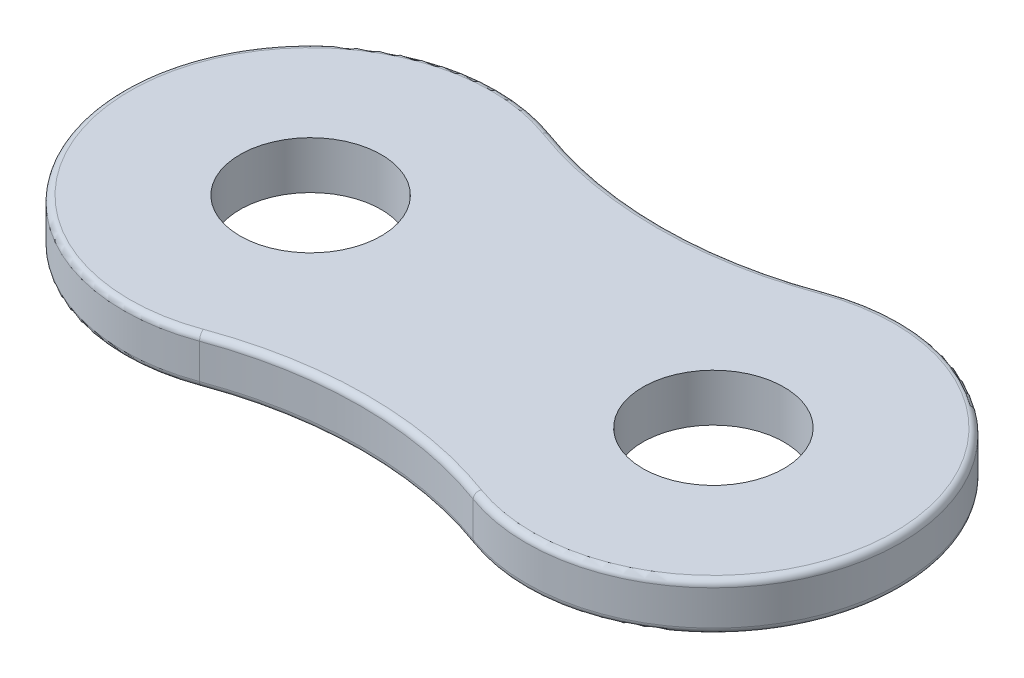
ISO-10303-21;
HEADER;
FILE_DESCRIPTION(('STEP AP214'),'2;1');
FILE_NAME('part.step','',(''),(''),'','','');
FILE_SCHEMA(('AUTOMOTIVE_DESIGN { 1 0 10303 214 1 1 1 1 }'));
ENDSEC;
DATA;
#1=APPLICATION_CONTEXT('core data for automotive mechanical design processes');
#2=APPLICATION_PROTOCOL_DEFINITION('international standard','automotive_design',2000,#1);
#3=PRODUCT_CONTEXT('',#1,'mechanical');
#4=PRODUCT('Part','Part','',(#3));
#5=PRODUCT_RELATED_PRODUCT_CATEGORY('part','',(#4));
#6=PRODUCT_DEFINITION_FORMATION('','',#4);
#7=PRODUCT_DEFINITION_CONTEXT('part definition',#1,'design');
#8=PRODUCT_DEFINITION('design','',#6,#7);
#9=PRODUCT_DEFINITION_SHAPE('','',#8);
#10=(LENGTH_UNIT() NAMED_UNIT(*) SI_UNIT(.MILLI.,.METRE.));
#11=(NAMED_UNIT(*) PLANE_ANGLE_UNIT() SI_UNIT($,.RADIAN.));
#12=(NAMED_UNIT(*) SI_UNIT($,.STERADIAN.) SOLID_ANGLE_UNIT());
#13=UNCERTAINTY_MEASURE_WITH_UNIT(LENGTH_MEASURE(1.E-05),#10,'distance_accuracy_value','');
#14=(GEOMETRIC_REPRESENTATION_CONTEXT(3) GLOBAL_UNCERTAINTY_ASSIGNED_CONTEXT((#13)) GLOBAL_UNIT_ASSIGNED_CONTEXT((#10,
#11,#12)) REPRESENTATION_CONTEXT('',''));
#15=CARTESIAN_POINT('',(0.,0.,0.));
#16=DIRECTION('',(0.,0.,1.));
#17=DIRECTION('',(1.,0.,0.));
#18=AXIS2_PLACEMENT_3D('',#15,#16,#17);
#19=CARTESIAN_POINT('',(9.525,1.5,-8.63477706718593));
#20=DIRECTION('',(0.,1.,0.));
#21=DIRECTION('',(0.,0.,1.));
#22=AXIS2_PLACEMENT_3D('',#19,#20,#21);
#23=PLANE('',#22);
#24=CARTESIAN_POINT('',(6.35,1.5,17.2695541343719));
#25=DIRECTION('',(0.,1.,0.));
#26=DIRECTION('',(0.,0.,1.));
#27=AXIS2_PLACEMENT_3D('',#24,#25,#26);
#28=CIRCLE('',#27,12.7);
#29=CARTESIAN_POINT('',(1.96711956521739,1.5,5.34980753075649));
#30=VERTEX_POINT('',#29);
#31=CARTESIAN_POINT('',(10.7328804347826,1.5,5.3498075307565));
#32=VERTEX_POINT('',#31);
#33=EDGE_CURVE('E61',#30,#32,#28,.F.);
#34=ORIENTED_EDGE('',*,*,#33,.T.);
#35=CARTESIAN_POINT('',(12.7,1.5,0.));
#36=DIRECTION('',(0.,1.,0.));
#37=DIRECTION('',(0.,0.,1.));
#38=AXIS2_PLACEMENT_3D('',#35,#36,#37);
#39=CIRCLE('',#38,5.7);
#40=CARTESIAN_POINT('',(10.7328804347826,1.5,-5.3498075307565));
#41=VERTEX_POINT('',#40);
#42=EDGE_CURVE('E121',#32,#41,#39,.T.);
#43=ORIENTED_EDGE('',*,*,#42,.T.);
#44=CARTESIAN_POINT('',(6.35,1.5,-17.2695541343719));
#45=DIRECTION('',(0.,1.,0.));
#46=DIRECTION('',(0.,0.,1.));
#47=AXIS2_PLACEMENT_3D('',#44,#45,#46);
#48=CIRCLE('',#47,12.7);
#49=CARTESIAN_POINT('',(1.96711956521739,1.5,-5.3498075307565));
#50=VERTEX_POINT('',#49);
#51=EDGE_CURVE('E147',#41,#50,#48,.F.);
#52=ORIENTED_EDGE('',*,*,#51,.T.);
#53=CARTESIAN_POINT('',(0.,1.5,0.));
#54=DIRECTION('',(0.,1.,0.));
#55=DIRECTION('',(0.,0.,1.));
#56=AXIS2_PLACEMENT_3D('',#53,#54,#55);
#57=CIRCLE('',#56,5.7);
#58=EDGE_CURVE('E66',#50,#30,#57,.T.);
#59=ORIENTED_EDGE('',*,*,#58,.T.);
#60=EDGE_LOOP('',(#34,#43,#52,#59));
#61=FACE_BOUND('',#60,.T.);
#62=CARTESIAN_POINT('',(12.7,1.5,0.));
#63=DIRECTION('',(0.,1.,0.));
#64=DIRECTION('',(0.,0.,1.));
#65=AXIS2_PLACEMENT_3D('',#62,#63,#64);
#66=CIRCLE('',#65,2.225);
#67=CARTESIAN_POINT('',(12.7,1.5,2.225));
#68=VERTEX_POINT('',#67);
#69=EDGE_CURVE('E135',#68,#68,#66,.T.);
#70=ORIENTED_EDGE('',*,*,#69,.F.);
#71=EDGE_LOOP('',(#70));
#72=FACE_BOUND('',#71,.T.);
#73=CARTESIAN_POINT('',(0.,1.5,0.));
#74=DIRECTION('',(0.,1.,0.));
#75=DIRECTION('',(0.,0.,1.));
#76=AXIS2_PLACEMENT_3D('',#73,#74,#75);
#77=CIRCLE('',#76,2.225);
#78=CARTESIAN_POINT('',(0.,1.5,2.225));
#79=VERTEX_POINT('',#78);
#80=EDGE_CURVE('E185',#79,#79,#77,.T.);
#81=ORIENTED_EDGE('',*,*,#80,.F.);
#82=EDGE_LOOP('',(#81));
#83=FACE_BOUND('',#82,.T.);
#84=ADVANCED_FACE('F43',(#61,#72,#83),#23,.T.);
#85=CARTESIAN_POINT('',(9.525,0.,-8.63477706718593));
#86=DIRECTION('',(0.,1.,0.));
#87=DIRECTION('',(0.,0.,1.));
#88=AXIS2_PLACEMENT_3D('',#85,#86,#87);
#89=PLANE('',#88);
#90=CARTESIAN_POINT('',(6.35,0.,-17.2695541343719));
#91=DIRECTION('',(0.,1.,0.));
#92=DIRECTION('',(0.,0.,1.));
#93=AXIS2_PLACEMENT_3D('',#90,#91,#92);
#94=CIRCLE('',#93,12.7);
#95=CARTESIAN_POINT('',(1.96711956521739,0.,-5.3498075307565));
#96=VERTEX_POINT('',#95);
#97=CARTESIAN_POINT('',(10.7328804347826,0.,-5.3498075307565));
#98=VERTEX_POINT('',#97);
#99=EDGE_CURVE('E210',#96,#98,#94,.T.);
#100=ORIENTED_EDGE('',*,*,#99,.T.);
#101=CARTESIAN_POINT('',(12.7,0.,0.));
#102=DIRECTION('',(0.,1.,0.));
#103=DIRECTION('',(0.,0.,1.));
#104=AXIS2_PLACEMENT_3D('',#101,#102,#103);
#105=CIRCLE('',#104,5.7);
#106=CARTESIAN_POINT('',(10.7328804347826,0.,5.3498075307565));
#107=VERTEX_POINT('',#106);
#108=EDGE_CURVE('E219',#98,#107,#105,.F.);
#109=ORIENTED_EDGE('',*,*,#108,.T.);
#110=CARTESIAN_POINT('',(6.35,0.,17.2695541343719));
#111=DIRECTION('',(0.,1.,0.));
#112=DIRECTION('',(0.,0.,1.));
#113=AXIS2_PLACEMENT_3D('',#110,#111,#112);
#114=CIRCLE('',#113,12.7);
#115=CARTESIAN_POINT('',(1.96711956521739,0.,5.34980753075649));
#116=VERTEX_POINT('',#115);
#117=EDGE_CURVE('E216',#107,#116,#114,.T.);
#118=ORIENTED_EDGE('',*,*,#117,.T.);
#119=CARTESIAN_POINT('',(0.,0.,0.));
#120=DIRECTION('',(0.,1.,0.));
#121=DIRECTION('',(0.,0.,1.));
#122=AXIS2_PLACEMENT_3D('',#119,#120,#121);
#123=CIRCLE('',#122,5.7);
#124=EDGE_CURVE('E213',#116,#96,#123,.F.);
#125=ORIENTED_EDGE('',*,*,#124,.T.);
#126=EDGE_LOOP('',(#100,#109,#118,#125));
#127=FACE_BOUND('',#126,.T.);
#128=CARTESIAN_POINT('',(12.7,0.,0.));
#129=DIRECTION('',(0.,1.,0.));
#130=DIRECTION('',(0.,0.,1.));
#131=AXIS2_PLACEMENT_3D('',#128,#129,#130);
#132=CIRCLE('',#131,2.225);
#133=CARTESIAN_POINT('',(12.7,0.,2.225));
#134=VERTEX_POINT('',#133);
#135=EDGE_CURVE('E191',#134,#134,#132,.T.);
#136=ORIENTED_EDGE('',*,*,#135,.T.);
#137=EDGE_LOOP('',(#136));
#138=FACE_BOUND('',#137,.T.);
#139=CARTESIAN_POINT('',(0.,0.,0.));
#140=DIRECTION('',(0.,1.,0.));
#141=DIRECTION('',(0.,0.,1.));
#142=AXIS2_PLACEMENT_3D('',#139,#140,#141);
#143=CIRCLE('',#142,2.225);
#144=CARTESIAN_POINT('',(0.,0.,2.225));
#145=VERTEX_POINT('',#144);
#146=EDGE_CURVE('E178',#145,#145,#143,.T.);
#147=ORIENTED_EDGE('',*,*,#146,.T.);
#148=EDGE_LOOP('',(#147));
#149=FACE_BOUND('',#148,.T.);
#150=ADVANCED_FACE('F268',(#127,#138,#149),#89,.F.);
#151=CARTESIAN_POINT('',(6.35,1.5,-17.2695541343719));
#152=DIRECTION('',(0.,-1.,0.));
#153=DIRECTION('',(0.,0.,-1.));
#154=AXIS2_PLACEMENT_3D('',#151,#152,#153);
#155=CYLINDRICAL_SURFACE('',#154,12.5);
#156=DIRECTION('',(0.,-1.,0.));
#157=VECTOR('',#156,1.);
#158=CARTESIAN_POINT('',(10.6638586956522,1.5,-5.53752007569532));
#159=LINE('',#158,#157);
#160=CARTESIAN_POINT('',(10.6638586956522,1.3,-5.53752007569532));
#161=VERTEX_POINT('',#160);
#162=CARTESIAN_POINT('',(10.6638586956522,0.2,-5.53752007569532));
#163=VERTEX_POINT('',#162);
#164=EDGE_CURVE('E113',#161,#163,#159,.T.);
#165=ORIENTED_EDGE('',*,*,#164,.T.);
#166=CARTESIAN_POINT('',(6.35,0.2,-17.2695541343719));
#167=DIRECTION('',(0.,1.,0.));
#168=DIRECTION('',(0.,0.,1.));
#169=AXIS2_PLACEMENT_3D('',#166,#167,#168);
#170=CIRCLE('',#169,12.5);
#171=CARTESIAN_POINT('',(2.03614130434782,0.2,-5.53752007569532));
#172=VERTEX_POINT('',#171);
#173=EDGE_CURVE('E11',#163,#172,#170,.F.);
#174=ORIENTED_EDGE('',*,*,#173,.T.);
#175=DIRECTION('',(0.,-1.,0.));
#176=VECTOR('',#175,1.);
#177=CARTESIAN_POINT('',(2.03614130434782,1.5,-5.53752007569532));
#178=LINE('',#177,#176);
#179=CARTESIAN_POINT('',(2.03614130434782,1.3,-5.53752007569532));
#180=VERTEX_POINT('',#179);
#181=EDGE_CURVE('E115',#180,#172,#178,.T.);
#182=ORIENTED_EDGE('',*,*,#181,.F.);
#183=CARTESIAN_POINT('',(6.35,1.3,-17.2695541343719));
#184=DIRECTION('',(0.,1.,0.));
#185=DIRECTION('',(0.,0.,1.));
#186=AXIS2_PLACEMENT_3D('',#183,#184,#185);
#187=CIRCLE('',#186,12.5);
#188=EDGE_CURVE('E53',#180,#161,#187,.T.);
#189=ORIENTED_EDGE('',*,*,#188,.T.);
#190=EDGE_LOOP('',(#165,#174,#182,#189));
#191=FACE_BOUND('',#190,.T.);
#192=ADVANCED_FACE('F112',(#191),#155,.F.);
#193=CARTESIAN_POINT('',(0.,1.5,0.));
#194=DIRECTION('',(0.,-1.,0.));
#195=DIRECTION('',(0.,0.,-1.));
#196=AXIS2_PLACEMENT_3D('',#193,#194,#195);
#197=CYLINDRICAL_SURFACE('',#196,5.9);
#198=ORIENTED_EDGE('',*,*,#181,.T.);
#199=CARTESIAN_POINT('',(0.,0.2,0.));
#200=DIRECTION('',(0.,1.,0.));
#201=DIRECTION('',(0.,0.,1.));
#202=AXIS2_PLACEMENT_3D('',#199,#200,#201);
#203=CIRCLE('',#202,5.9);
#204=CARTESIAN_POINT('',(2.03614130434783,0.2,5.53752007569532));
#205=VERTEX_POINT('',#204);
#206=EDGE_CURVE('E232',#172,#205,#203,.T.);
#207=ORIENTED_EDGE('',*,*,#206,.T.);
#208=DIRECTION('',(0.,-1.,0.));
#209=VECTOR('',#208,1.);
#210=CARTESIAN_POINT('',(2.03614130434783,1.5,5.53752007569532));
#211=LINE('',#210,#209);
#212=CARTESIAN_POINT('',(2.03614130434783,1.3,5.53752007569532));
#213=VERTEX_POINT('',#212);
#214=EDGE_CURVE('E202',#213,#205,#211,.T.);
#215=ORIENTED_EDGE('',*,*,#214,.F.);
#216=CARTESIAN_POINT('',(0.,1.3,0.));
#217=DIRECTION('',(0.,1.,0.));
#218=DIRECTION('',(0.,0.,1.));
#219=AXIS2_PLACEMENT_3D('',#216,#217,#218);
#220=CIRCLE('',#219,5.9);
#221=EDGE_CURVE('E229',#213,#180,#220,.F.);
#222=ORIENTED_EDGE('',*,*,#221,.T.);
#223=EDGE_LOOP('',(#198,#207,#215,#222));
#224=FACE_BOUND('',#223,.T.);
#225=ADVANCED_FACE('F250',(#224),#197,.T.);
#226=CARTESIAN_POINT('',(6.35,1.5,17.2695541343719));
#227=DIRECTION('',(0.,-1.,0.));
#228=DIRECTION('',(0.,0.,-1.));
#229=AXIS2_PLACEMENT_3D('',#226,#227,#228);
#230=CYLINDRICAL_SURFACE('',#229,12.5);
#231=ORIENTED_EDGE('',*,*,#214,.T.);
#232=CARTESIAN_POINT('',(6.35,0.2,17.2695541343719));
#233=DIRECTION('',(0.,1.,0.));
#234=DIRECTION('',(0.,0.,1.));
#235=AXIS2_PLACEMENT_3D('',#232,#233,#234);
#236=CIRCLE('',#235,12.5);
#237=CARTESIAN_POINT('',(10.6638586956522,0.2,5.53752007569532));
#238=VERTEX_POINT('',#237);
#239=EDGE_CURVE('E226',#205,#238,#236,.F.);
#240=ORIENTED_EDGE('',*,*,#239,.T.);
#241=DIRECTION('',(0.,-1.,0.));
#242=VECTOR('',#241,1.);
#243=CARTESIAN_POINT('',(10.6638586956522,1.5,5.53752007569532));
#244=LINE('',#243,#242);
#245=CARTESIAN_POINT('',(10.6638586956522,1.3,5.53752007569532));
#246=VERTEX_POINT('',#245);
#247=EDGE_CURVE('E134',#246,#238,#244,.T.);
#248=ORIENTED_EDGE('',*,*,#247,.F.);
#249=CARTESIAN_POINT('',(6.35,1.3,17.2695541343719));
#250=DIRECTION('',(0.,1.,0.));
#251=DIRECTION('',(0.,0.,1.));
#252=AXIS2_PLACEMENT_3D('',#249,#250,#251);
#253=CIRCLE('',#252,12.5);
#254=EDGE_CURVE('E223',#246,#213,#253,.T.);
#255=ORIENTED_EDGE('',*,*,#254,.T.);
#256=EDGE_LOOP('',(#231,#240,#248,#255));
#257=FACE_BOUND('',#256,.T.);
#258=ADVANCED_FACE('F248',(#257),#230,.F.);
#259=CARTESIAN_POINT('',(12.7,1.5,0.));
#260=DIRECTION('',(0.,-1.,0.));
#261=DIRECTION('',(0.,0.,-1.));
#262=AXIS2_PLACEMENT_3D('',#259,#260,#261);
#263=CYLINDRICAL_SURFACE('',#262,5.9);
#264=ORIENTED_EDGE('',*,*,#247,.T.);
#265=CARTESIAN_POINT('',(12.7,0.2,0.));
#266=DIRECTION('',(0.,1.,0.));
#267=DIRECTION('',(0.,0.,1.));
#268=AXIS2_PLACEMENT_3D('',#265,#266,#267);
#269=CIRCLE('',#268,5.9);
#270=EDGE_CURVE('E132',#238,#163,#269,.T.);
#271=ORIENTED_EDGE('',*,*,#270,.T.);
#272=ORIENTED_EDGE('',*,*,#164,.F.);
#273=CARTESIAN_POINT('',(12.7,1.3,0.));
#274=DIRECTION('',(0.,1.,0.));
#275=DIRECTION('',(0.,0.,1.));
#276=AXIS2_PLACEMENT_3D('',#273,#274,#275);
#277=CIRCLE('',#276,5.9);
#278=EDGE_CURVE('E129',#161,#246,#277,.F.);
#279=ORIENTED_EDGE('',*,*,#278,.T.);
#280=EDGE_LOOP('',(#264,#271,#272,#279));
#281=FACE_BOUND('',#280,.T.);
#282=ADVANCED_FACE('F128',(#281),#263,.T.);
#283=CARTESIAN_POINT('',(12.7,1.5,0.));
#284=DIRECTION('',(0.,-1.,0.));
#285=DIRECTION('',(0.,0.,-1.));
#286=AXIS2_PLACEMENT_3D('',#283,#284,#285);
#287=CYLINDRICAL_SURFACE('',#286,2.225);
#288=ORIENTED_EDGE('',*,*,#69,.T.);
#289=EDGE_LOOP('',(#288));
#290=FACE_BOUND('',#289,.T.);
#291=ORIENTED_EDGE('',*,*,#135,.F.);
#292=EDGE_LOOP('',(#291));
#293=FACE_BOUND('',#292,.T.);
#294=ADVANCED_FACE('F276',(#290,#293),#287,.F.);
#295=CARTESIAN_POINT('',(0.,1.5,0.));
#296=DIRECTION('',(0.,-1.,0.));
#297=DIRECTION('',(0.,0.,-1.));
#298=AXIS2_PLACEMENT_3D('',#295,#296,#297);
#299=CYLINDRICAL_SURFACE('',#298,2.225);
#300=ORIENTED_EDGE('',*,*,#80,.T.);
#301=EDGE_LOOP('',(#300));
#302=FACE_BOUND('',#301,.T.);
#303=ORIENTED_EDGE('',*,*,#146,.F.);
#304=EDGE_LOOP('',(#303));
#305=FACE_BOUND('',#304,.T.);
#306=ADVANCED_FACE('F308',(#302,#305),#299,.F.);
#307=CARTESIAN_POINT('',(0.,0.2,0.));
#308=DIRECTION('',(0.,1.,0.));
#309=DIRECTION('',(0.,0.,1.));
#310=AXIS2_PLACEMENT_3D('',#307,#308,#309);
#311=TOROIDAL_SURFACE('',#310,5.7,0.2);
#312=CARTESIAN_POINT('',(1.96711956521739,0.2,-5.3498075307565));
#313=DIRECTION('',(0.938562724694123,0.,0.345108695652173));
#314=DIRECTION('',(0.345108695652173,0.,-0.938562724694123));
#315=AXIS2_PLACEMENT_3D('',#312,#313,#314);
#316=CIRCLE('',#315,0.2);
#317=EDGE_CURVE('E169',#96,#172,#316,.T.);
#318=ORIENTED_EDGE('',*,*,#317,.F.);
#319=ORIENTED_EDGE('',*,*,#124,.F.);
#320=CARTESIAN_POINT('',(1.96711956521739,0.2,5.34980753075649));
#321=DIRECTION('',(0.938562724694122,0.,-0.345108695652175));
#322=DIRECTION('',(-0.345108695652175,0.,-0.938562724694122));
#323=AXIS2_PLACEMENT_3D('',#320,#321,#322);
#324=CIRCLE('',#323,0.2);
#325=EDGE_CURVE('E154',#205,#116,#324,.T.);
#326=ORIENTED_EDGE('',*,*,#325,.F.);
#327=ORIENTED_EDGE('',*,*,#206,.F.);
#328=EDGE_LOOP('',(#318,#319,#326,#327));
#329=FACE_BOUND('',#328,.T.);
#330=ADVANCED_FACE('F253',(#329),#311,.T.);
#331=CARTESIAN_POINT('',(6.35,0.2,17.2695541343719));
#332=DIRECTION('',(0.,1.,0.));
#333=DIRECTION('',(0.,0.,1.));
#334=AXIS2_PLACEMENT_3D('',#331,#332,#333);
#335=TOROIDAL_SURFACE('',#334,12.7,0.2);
#336=ORIENTED_EDGE('',*,*,#325,.T.);
#337=ORIENTED_EDGE('',*,*,#117,.F.);
#338=CARTESIAN_POINT('',(10.7328804347826,0.2,5.3498075307565));
#339=DIRECTION('',(0.938562724694123,0.,0.345108695652173));
#340=DIRECTION('',(0.345108695652173,0.,-0.938562724694123));
#341=AXIS2_PLACEMENT_3D('',#338,#339,#340);
#342=CIRCLE('',#341,0.2);
#343=EDGE_CURVE('E162',#238,#107,#342,.T.);
#344=ORIENTED_EDGE('',*,*,#343,.F.);
#345=ORIENTED_EDGE('',*,*,#239,.F.);
#346=EDGE_LOOP('',(#336,#337,#344,#345));
#347=FACE_BOUND('',#346,.T.);
#348=ADVANCED_FACE('F256',(#347),#335,.T.);
#349=CARTESIAN_POINT('',(6.35,0.2,-17.2695541343719));
#350=DIRECTION('',(0.,1.,0.));
#351=DIRECTION('',(0.,0.,1.));
#352=AXIS2_PLACEMENT_3D('',#349,#350,#351);
#353=TOROIDAL_SURFACE('',#352,12.7,0.2);
#354=ORIENTED_EDGE('',*,*,#317,.T.);
#355=ORIENTED_EDGE('',*,*,#173,.F.);
#356=CARTESIAN_POINT('',(10.7328804347826,0.2,-5.3498075307565));
#357=DIRECTION('',(0.938562724694123,0.,-0.345108695652172));
#358=DIRECTION('',(-0.345108695652172,0.,-0.938562724694123));
#359=AXIS2_PLACEMENT_3D('',#356,#357,#358);
#360=CIRCLE('',#359,0.2);
#361=EDGE_CURVE('E159',#98,#163,#360,.T.);
#362=ORIENTED_EDGE('',*,*,#361,.F.);
#363=ORIENTED_EDGE('',*,*,#99,.F.);
#364=EDGE_LOOP('',(#354,#355,#362,#363));
#365=FACE_BOUND('',#364,.T.);
#366=ADVANCED_FACE('F259',(#365),#353,.T.);
#367=CARTESIAN_POINT('',(12.7,0.2,0.));
#368=DIRECTION('',(0.,1.,0.));
#369=DIRECTION('',(0.,0.,1.));
#370=AXIS2_PLACEMENT_3D('',#367,#368,#369);
#371=TOROIDAL_SURFACE('',#370,5.7,0.2);
#372=ORIENTED_EDGE('',*,*,#343,.T.);
#373=ORIENTED_EDGE('',*,*,#108,.F.);
#374=ORIENTED_EDGE('',*,*,#361,.T.);
#375=ORIENTED_EDGE('',*,*,#270,.F.);
#376=EDGE_LOOP('',(#372,#373,#374,#375));
#377=FACE_BOUND('',#376,.T.);
#378=ADVANCED_FACE('F257',(#377),#371,.T.);
#379=CARTESIAN_POINT('',(0.,1.3,0.));
#380=DIRECTION('',(0.,1.,0.));
#381=DIRECTION('',(0.,0.,1.));
#382=AXIS2_PLACEMENT_3D('',#379,#380,#381);
#383=TOROIDAL_SURFACE('',#382,5.7,0.2);
#384=CARTESIAN_POINT('',(1.96711956521739,1.3,-5.3498075307565));
#385=DIRECTION('',(0.938562724694123,0.,0.345108695652173));
#386=DIRECTION('',(0.345108695652173,0.,-0.938562724694123));
#387=AXIS2_PLACEMENT_3D('',#384,#385,#386);
#388=CIRCLE('',#387,0.2);
#389=EDGE_CURVE('E151',#180,#50,#388,.T.);
#390=ORIENTED_EDGE('',*,*,#389,.F.);
#391=ORIENTED_EDGE('',*,*,#221,.F.);
#392=CARTESIAN_POINT('',(1.96711956521739,1.3,5.34980753075649));
#393=DIRECTION('',(0.938562724694123,0.,-0.345108695652173));
#394=DIRECTION('',(-0.345108695652173,0.,-0.938562724694123));
#395=AXIS2_PLACEMENT_3D('',#392,#393,#394);
#396=CIRCLE('',#395,0.2);
#397=EDGE_CURVE('E47',#30,#213,#396,.T.);
#398=ORIENTED_EDGE('',*,*,#397,.F.);
#399=ORIENTED_EDGE('',*,*,#58,.F.);
#400=EDGE_LOOP('',(#390,#391,#398,#399));
#401=FACE_BOUND('',#400,.T.);
#402=ADVANCED_FACE('F45',(#401),#383,.T.);
#403=CARTESIAN_POINT('',(6.35,1.3,17.2695541343719));
#404=DIRECTION('',(0.,1.,0.));
#405=DIRECTION('',(0.,0.,1.));
#406=AXIS2_PLACEMENT_3D('',#403,#404,#405);
#407=TOROIDAL_SURFACE('',#406,12.7,0.2);
#408=ORIENTED_EDGE('',*,*,#397,.T.);
#409=ORIENTED_EDGE('',*,*,#254,.F.);
#410=CARTESIAN_POINT('',(10.7328804347826,1.3,5.3498075307565));
#411=DIRECTION('',(0.938562724694123,0.,0.345108695652173));
#412=DIRECTION('',(0.345108695652173,0.,-0.938562724694123));
#413=AXIS2_PLACEMENT_3D('',#410,#411,#412);
#414=CIRCLE('',#413,0.2);
#415=EDGE_CURVE('E142',#32,#246,#414,.T.);
#416=ORIENTED_EDGE('',*,*,#415,.F.);
#417=ORIENTED_EDGE('',*,*,#33,.F.);
#418=EDGE_LOOP('',(#408,#409,#416,#417));
#419=FACE_BOUND('',#418,.T.);
#420=ADVANCED_FACE('F245',(#419),#407,.T.);
#421=CARTESIAN_POINT('',(6.35,1.3,-17.2695541343719));
#422=DIRECTION('',(0.,1.,0.));
#423=DIRECTION('',(0.,0.,1.));
#424=AXIS2_PLACEMENT_3D('',#421,#422,#423);
#425=TOROIDAL_SURFACE('',#424,12.7,0.2);
#426=ORIENTED_EDGE('',*,*,#389,.T.);
#427=ORIENTED_EDGE('',*,*,#51,.F.);
#428=CARTESIAN_POINT('',(10.7328804347826,1.3,-5.3498075307565));
#429=DIRECTION('',(0.938562724694123,0.,-0.345108695652173));
#430=DIRECTION('',(-0.345108695652173,0.,-0.938562724694123));
#431=AXIS2_PLACEMENT_3D('',#428,#429,#430);
#432=CIRCLE('',#431,0.2);
#433=EDGE_CURVE('E140',#161,#41,#432,.T.);
#434=ORIENTED_EDGE('',*,*,#433,.F.);
#435=ORIENTED_EDGE('',*,*,#188,.F.);
#436=EDGE_LOOP('',(#426,#427,#434,#435));
#437=FACE_BOUND('',#436,.T.);
#438=ADVANCED_FACE('F146',(#437),#425,.T.);
#439=CARTESIAN_POINT('',(12.7,1.3,0.));
#440=DIRECTION('',(0.,1.,0.));
#441=DIRECTION('',(0.,0.,1.));
#442=AXIS2_PLACEMENT_3D('',#439,#440,#441);
#443=TOROIDAL_SURFACE('',#442,5.7,0.2);
#444=ORIENTED_EDGE('',*,*,#415,.T.);
#445=ORIENTED_EDGE('',*,*,#278,.F.);
#446=ORIENTED_EDGE('',*,*,#433,.T.);
#447=ORIENTED_EDGE('',*,*,#42,.F.);
#448=EDGE_LOOP('',(#444,#445,#446,#447));
#449=FACE_BOUND('',#448,.T.);
#450=ADVANCED_FACE('F138',(#449),#443,.T.);
#451=CLOSED_SHELL('',(#84,#150,#192,#225,#258,#282,#294,#306,#330,#348,#366,#378,#402,#420,#438,#450));
#452=MANIFOLD_SOLID_BREP('B2',#451);
#453=ADVANCED_BREP_SHAPE_REPRESENTATION('',(#18,#452),#14);
#454=SHAPE_DEFINITION_REPRESENTATION(#9,#453);
ENDSEC;
END-ISO-10303-21;
